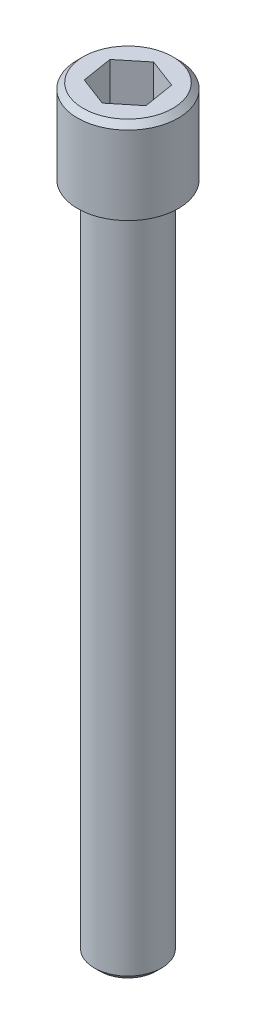
ISO-10303-21;
HEADER;
FILE_DESCRIPTION(('STEP AP214'),'2;1');
FILE_NAME('part.step','',(''),(''),'','','');
FILE_SCHEMA(('AUTOMOTIVE_DESIGN { 1 0 10303 214 1 1 1 1 }'));
ENDSEC;
DATA;
#1=APPLICATION_CONTEXT('core data for automotive mechanical design processes');
#2=APPLICATION_PROTOCOL_DEFINITION('international standard','automotive_design',2000,#1);
#3=PRODUCT_CONTEXT('',#1,'mechanical');
#4=PRODUCT('Part','Part','',(#3));
#5=PRODUCT_RELATED_PRODUCT_CATEGORY('part','',(#4));
#6=PRODUCT_DEFINITION_FORMATION('','',#4);
#7=PRODUCT_DEFINITION_CONTEXT('part definition',#1,'design');
#8=PRODUCT_DEFINITION('design','',#6,#7);
#9=PRODUCT_DEFINITION_SHAPE('','',#8);
#10=(LENGTH_UNIT() NAMED_UNIT(*) SI_UNIT(.MILLI.,.METRE.));
#11=(NAMED_UNIT(*) PLANE_ANGLE_UNIT() SI_UNIT($,.RADIAN.));
#12=(NAMED_UNIT(*) SI_UNIT($,.STERADIAN.) SOLID_ANGLE_UNIT());
#13=UNCERTAINTY_MEASURE_WITH_UNIT(LENGTH_MEASURE(1.E-05),#10,'distance_accuracy_value','');
#14=(GEOMETRIC_REPRESENTATION_CONTEXT(3) GLOBAL_UNCERTAINTY_ASSIGNED_CONTEXT((#13)) GLOBAL_UNIT_ASSIGNED_CONTEXT((#10,
#11,#12)) REPRESENTATION_CONTEXT('',''));
#15=CARTESIAN_POINT('',(0.,0.,0.));
#16=DIRECTION('',(0.,0.,1.));
#17=DIRECTION('',(1.,0.,0.));
#18=AXIS2_PLACEMENT_3D('',#15,#16,#17);
#19=CARTESIAN_POINT('',(0.,30.,0.));
#20=DIRECTION('',(0.,-1.,0.));
#21=DIRECTION('',(0.,0.,-1.));
#22=AXIS2_PLACEMENT_3D('',#19,#20,#21);
#23=CYLINDRICAL_SURFACE('',#22,1.5);
#24=CARTESIAN_POINT('',(0.,0.25,0.));
#25=DIRECTION('',(0.,1.,0.));
#26=DIRECTION('',(0.,0.,1.));
#27=AXIS2_PLACEMENT_3D('',#24,#25,#26);
#28=CIRCLE('',#27,1.5);
#29=CARTESIAN_POINT('',(0.,0.25,1.5));
#30=VERTEX_POINT('',#29);
#31=EDGE_CURVE('E43',#30,#30,#28,.T.);
#32=ORIENTED_EDGE('',*,*,#31,.T.);
#33=EDGE_LOOP('',(#32));
#34=FACE_BOUND('',#33,.T.);
#35=CARTESIAN_POINT('',(0.,30.,0.));
#36=DIRECTION('',(0.,1.,0.));
#37=DIRECTION('',(0.,0.,1.));
#38=AXIS2_PLACEMENT_3D('',#35,#36,#37);
#39=CIRCLE('',#38,1.5);
#40=CARTESIAN_POINT('',(0.,30.,1.5));
#41=VERTEX_POINT('',#40);
#42=EDGE_CURVE('E145',#41,#41,#39,.T.);
#43=ORIENTED_EDGE('',*,*,#42,.F.);
#44=EDGE_LOOP('',(#43));
#45=FACE_BOUND('',#44,.T.);
#46=ADVANCED_FACE('F35',(#34,#45),#23,.T.);
#47=CARTESIAN_POINT('',(0.,0.,0.));
#48=DIRECTION('',(0.,1.,0.));
#49=DIRECTION('',(0.,0.,1.));
#50=AXIS2_PLACEMENT_3D('',#47,#48,#49);
#51=PLANE('',#50);
#52=CARTESIAN_POINT('',(0.,0.,0.));
#53=DIRECTION('',(0.,1.,0.));
#54=DIRECTION('',(0.,0.,1.));
#55=AXIS2_PLACEMENT_3D('',#52,#53,#54);
#56=CIRCLE('',#55,1.25);
#57=CARTESIAN_POINT('',(0.,0.,1.25));
#58=VERTEX_POINT('',#57);
#59=EDGE_CURVE('E11',#58,#58,#56,.F.);
#60=ORIENTED_EDGE('',*,*,#59,.T.);
#61=EDGE_LOOP('',(#60));
#62=FACE_BOUND('',#61,.T.);
#63=ADVANCED_FACE('F167',(#62),#51,.F.);
#64=CARTESIAN_POINT('',(0.,33.75,0.));
#65=DIRECTION('',(0.,-1.,0.));
#66=DIRECTION('',(0.,0.,-1.));
#67=AXIS2_PLACEMENT_3D('',#64,#65,#66);
#68=CYLINDRICAL_SURFACE('',#67,2.25);
#69=CARTESIAN_POINT('',(0.,33.5,0.));
#70=DIRECTION('',(0.,1.,0.));
#71=DIRECTION('',(0.,0.,1.));
#72=AXIS2_PLACEMENT_3D('',#69,#70,#71);
#73=CIRCLE('',#72,2.25);
#74=CARTESIAN_POINT('',(0.,33.5,2.25));
#75=VERTEX_POINT('',#74);
#76=EDGE_CURVE('E151',#75,#75,#73,.F.);
#77=ORIENTED_EDGE('',*,*,#76,.T.);
#78=EDGE_LOOP('',(#77));
#79=FACE_BOUND('',#78,.T.);
#80=CARTESIAN_POINT('',(0.,30.,0.));
#81=DIRECTION('',(0.,1.,0.));
#82=DIRECTION('',(0.,0.,1.));
#83=AXIS2_PLACEMENT_3D('',#80,#81,#82);
#84=CIRCLE('',#83,2.25);
#85=CARTESIAN_POINT('',(0.,30.,2.25));
#86=VERTEX_POINT('',#85);
#87=EDGE_CURVE('E137',#86,#86,#84,.T.);
#88=ORIENTED_EDGE('',*,*,#87,.T.);
#89=EDGE_LOOP('',(#88));
#90=FACE_BOUND('',#89,.T.);
#91=ADVANCED_FACE('F172',(#79,#90),#68,.T.);
#92=CARTESIAN_POINT('',(0.,33.75,0.));
#93=DIRECTION('',(0.,1.,0.));
#94=DIRECTION('',(0.,0.,1.));
#95=AXIS2_PLACEMENT_3D('',#92,#93,#94);
#96=PLANE('',#95);
#97=CARTESIAN_POINT('',(0.,33.75,0.));
#98=DIRECTION('',(0.,1.,0.));
#99=DIRECTION('',(0.,0.,1.));
#100=AXIS2_PLACEMENT_3D('',#97,#98,#99);
#101=CIRCLE('',#100,2.);
#102=CARTESIAN_POINT('',(0.,33.75,2.));
#103=VERTEX_POINT('',#102);
#104=EDGE_CURVE('E148',#103,#103,#101,.T.);
#105=ORIENTED_EDGE('',*,*,#104,.T.);
#106=EDGE_LOOP('',(#105));
#107=FACE_BOUND('',#106,.T.);
#108=DIRECTION('',(0.159195520088402,0.,0.987247074639263));
#109=VECTOR('',#108,1.);
#110=CARTESIAN_POINT('',(-1.2949903812193,33.75,-0.492950213053497));
#111=LINE('',#110,#109);
#112=CARTESIAN_POINT('',(-1.2949903812193,33.75,-0.492950213053497));
#113=VERTEX_POINT('',#112);
#114=CARTESIAN_POINT('',(-1.07440259791493,33.75,0.875019461265662));
#115=VERTEX_POINT('',#114);
#116=EDGE_CURVE('E50',#113,#115,#111,.T.);
#117=ORIENTED_EDGE('',*,*,#116,.F.);
#118=DIRECTION('',(-0.775383286405273,0.,0.631490901884864));
#119=VECTOR('',#118,1.);
#120=CARTESIAN_POINT('',(-0.220587783304371,33.75,-1.36796967431916));
#121=LINE('',#120,#119);
#122=CARTESIAN_POINT('',(-0.220587783304371,33.75,-1.36796967431916));
#123=VERTEX_POINT('',#122);
#124=EDGE_CURVE('E133',#123,#113,#121,.T.);
#125=ORIENTED_EDGE('',*,*,#124,.F.);
#126=DIRECTION('',(-0.934578806493675,0.,-0.3557561727544));
#127=VECTOR('',#126,1.);
#128=CARTESIAN_POINT('',(1.07440259791493,33.75,-0.875019461265662));
#129=LINE('',#128,#127);
#130=CARTESIAN_POINT('',(1.07440259791493,33.75,-0.875019461265662));
#131=VERTEX_POINT('',#130);
#132=EDGE_CURVE('E131',#131,#123,#129,.T.);
#133=ORIENTED_EDGE('',*,*,#132,.F.);
#134=DIRECTION('',(-0.159195520088402,0.,-0.987247074639263));
#135=VECTOR('',#134,1.);
#136=CARTESIAN_POINT('',(1.2949903812193,33.75,0.492950213053496));
#137=LINE('',#136,#135);
#138=CARTESIAN_POINT('',(1.2949903812193,33.75,0.492950213053496));
#139=VERTEX_POINT('',#138);
#140=EDGE_CURVE('E98',#139,#131,#137,.T.);
#141=ORIENTED_EDGE('',*,*,#140,.F.);
#142=DIRECTION('',(0.775383286405273,0.,-0.631490901884864));
#143=VECTOR('',#142,1.);
#144=CARTESIAN_POINT('',(0.220587783304371,33.75,1.36796967431916));
#145=LINE('',#144,#143);
#146=CARTESIAN_POINT('',(0.220587783304371,33.75,1.36796967431916));
#147=VERTEX_POINT('',#146);
#148=EDGE_CURVE('E127',#147,#139,#145,.T.);
#149=ORIENTED_EDGE('',*,*,#148,.F.);
#150=DIRECTION('',(0.934578806493675,0.,0.3557561727544));
#151=VECTOR('',#150,1.);
#152=CARTESIAN_POINT('',(-1.07440259791493,33.75,0.875019461265662));
#153=LINE('',#152,#151);
#154=EDGE_CURVE('E124',#115,#147,#153,.T.);
#155=ORIENTED_EDGE('',*,*,#154,.F.);
#156=EDGE_LOOP('',(#117,#125,#133,#141,#149,#155));
#157=FACE_BOUND('',#156,.T.);
#158=ADVANCED_FACE('F178',(#107,#157),#96,.T.);
#159=CARTESIAN_POINT('',(0.,30.,0.));
#160=DIRECTION('',(0.,1.,0.));
#161=DIRECTION('',(0.,0.,1.));
#162=AXIS2_PLACEMENT_3D('',#159,#160,#161);
#163=PLANE('',#162);
#164=ORIENTED_EDGE('',*,*,#42,.T.);
#165=EDGE_LOOP('',(#164));
#166=FACE_BOUND('',#165,.T.);
#167=ORIENTED_EDGE('',*,*,#87,.F.);
#168=EDGE_LOOP('',(#167));
#169=FACE_BOUND('',#168,.T.);
#170=ADVANCED_FACE('F180',(#166,#169),#163,.F.);
#171=CARTESIAN_POINT('',(-1.2949903812193,31.5,-0.492950213053497));
#172=DIRECTION('',(-0.987247074639263,0.,0.159195520088402));
#173=DIRECTION('',(0.159195520088402,0.,0.987247074639263));
#174=AXIS2_PLACEMENT_3D('',#171,#172,#173);
#175=PLANE('',#174);
#176=ORIENTED_EDGE('',*,*,#116,.T.);
#177=DIRECTION('',(0.,1.,0.));
#178=VECTOR('',#177,1.);
#179=CARTESIAN_POINT('',(-1.07440259791493,31.5,0.875019461265662));
#180=LINE('',#179,#178);
#181=CARTESIAN_POINT('',(-1.07440259791493,31.5,0.875019461265662));
#182=VERTEX_POINT('',#181);
#183=EDGE_CURVE('E80',#182,#115,#180,.T.);
#184=ORIENTED_EDGE('',*,*,#183,.F.);
#185=DIRECTION('',(0.159195520088402,0.,0.987247074639263));
#186=VECTOR('',#185,1.);
#187=CARTESIAN_POINT('',(-1.2949903812193,31.5,-0.492950213053497));
#188=LINE('',#187,#186);
#189=CARTESIAN_POINT('',(-1.2949903812193,31.5,-0.492950213053497));
#190=VERTEX_POINT('',#189);
#191=EDGE_CURVE('E135',#190,#182,#188,.T.);
#192=ORIENTED_EDGE('',*,*,#191,.F.);
#193=DIRECTION('',(0.,1.,0.));
#194=VECTOR('',#193,1.);
#195=CARTESIAN_POINT('',(-1.2949903812193,31.5,-0.492950213053497));
#196=LINE('',#195,#194);
#197=EDGE_CURVE('E58',#190,#113,#196,.T.);
#198=ORIENTED_EDGE('',*,*,#197,.T.);
#199=EDGE_LOOP('',(#176,#184,#192,#198));
#200=FACE_BOUND('',#199,.T.);
#201=ADVANCED_FACE('F183',(#200),#175,.F.);
#202=CARTESIAN_POINT('',(-0.220587783304371,31.5,-1.36796967431916));
#203=DIRECTION('',(-0.631490901884864,0.,-0.775383286405273));
#204=DIRECTION('',(-0.775383286405273,0.,0.631490901884864));
#205=AXIS2_PLACEMENT_3D('',#202,#203,#204);
#206=PLANE('',#205);
#207=ORIENTED_EDGE('',*,*,#124,.T.);
#208=ORIENTED_EDGE('',*,*,#197,.F.);
#209=DIRECTION('',(-0.775383286405273,0.,0.631490901884864));
#210=VECTOR('',#209,1.);
#211=CARTESIAN_POINT('',(-0.220587783304371,31.5,-1.36796967431916));
#212=LINE('',#211,#210);
#213=CARTESIAN_POINT('',(-0.220587783304371,31.5,-1.36796967431916));
#214=VERTEX_POINT('',#213);
#215=EDGE_CURVE('E110',#214,#190,#212,.T.);
#216=ORIENTED_EDGE('',*,*,#215,.F.);
#217=DIRECTION('',(0.,1.,0.));
#218=VECTOR('',#217,1.);
#219=CARTESIAN_POINT('',(-0.220587783304371,31.5,-1.36796967431916));
#220=LINE('',#219,#218);
#221=EDGE_CURVE('E102',#214,#123,#220,.T.);
#222=ORIENTED_EDGE('',*,*,#221,.T.);
#223=EDGE_LOOP('',(#207,#208,#216,#222));
#224=FACE_BOUND('',#223,.T.);
#225=ADVANCED_FACE('F190',(#224),#206,.F.);
#226=CARTESIAN_POINT('',(1.07440259791493,31.5,-0.875019461265662));
#227=DIRECTION('',(0.3557561727544,0.,-0.934578806493675));
#228=DIRECTION('',(-0.934578806493675,0.,-0.3557561727544));
#229=AXIS2_PLACEMENT_3D('',#226,#227,#228);
#230=PLANE('',#229);
#231=ORIENTED_EDGE('',*,*,#132,.T.);
#232=ORIENTED_EDGE('',*,*,#221,.F.);
#233=DIRECTION('',(-0.934578806493675,0.,-0.3557561727544));
#234=VECTOR('',#233,1.);
#235=CARTESIAN_POINT('',(1.07440259791493,31.5,-0.875019461265662));
#236=LINE('',#235,#234);
#237=CARTESIAN_POINT('',(1.07440259791493,31.5,-0.875019461265662));
#238=VERTEX_POINT('',#237);
#239=EDGE_CURVE('E106',#238,#214,#236,.T.);
#240=ORIENTED_EDGE('',*,*,#239,.F.);
#241=DIRECTION('',(0.,1.,0.));
#242=VECTOR('',#241,1.);
#243=CARTESIAN_POINT('',(1.07440259791493,31.5,-0.875019461265662));
#244=LINE('',#243,#242);
#245=EDGE_CURVE('E91',#238,#131,#244,.T.);
#246=ORIENTED_EDGE('',*,*,#245,.T.);
#247=EDGE_LOOP('',(#231,#232,#240,#246));
#248=FACE_BOUND('',#247,.T.);
#249=ADVANCED_FACE('F107',(#248),#230,.F.);
#250=CARTESIAN_POINT('',(1.2949903812193,31.5,0.492950213053496));
#251=DIRECTION('',(0.987247074639263,0.,-0.159195520088402));
#252=DIRECTION('',(-0.159195520088403,0.,-0.987247074639263));
#253=AXIS2_PLACEMENT_3D('',#250,#251,#252);
#254=PLANE('',#253);
#255=ORIENTED_EDGE('',*,*,#140,.T.);
#256=ORIENTED_EDGE('',*,*,#245,.F.);
#257=DIRECTION('',(-0.159195520088402,0.,-0.987247074639263));
#258=VECTOR('',#257,1.);
#259=CARTESIAN_POINT('',(1.2949903812193,31.5,0.492950213053496));
#260=LINE('',#259,#258);
#261=CARTESIAN_POINT('',(1.2949903812193,31.5,0.492950213053496));
#262=VERTEX_POINT('',#261);
#263=EDGE_CURVE('E95',#262,#238,#260,.T.);
#264=ORIENTED_EDGE('',*,*,#263,.F.);
#265=DIRECTION('',(0.,1.,0.));
#266=VECTOR('',#265,1.);
#267=CARTESIAN_POINT('',(1.2949903812193,31.5,0.492950213053496));
#268=LINE('',#267,#266);
#269=EDGE_CURVE('E103',#262,#139,#268,.T.);
#270=ORIENTED_EDGE('',*,*,#269,.T.);
#271=EDGE_LOOP('',(#255,#256,#264,#270));
#272=FACE_BOUND('',#271,.T.);
#273=ADVANCED_FACE('F93',(#272),#254,.F.);
#274=CARTESIAN_POINT('',(0.220587783304371,31.5,1.36796967431916));
#275=DIRECTION('',(0.631490901884864,0.,0.775383286405273));
#276=DIRECTION('',(0.775383286405273,0.,-0.631490901884864));
#277=AXIS2_PLACEMENT_3D('',#274,#275,#276);
#278=PLANE('',#277);
#279=ORIENTED_EDGE('',*,*,#148,.T.);
#280=ORIENTED_EDGE('',*,*,#269,.F.);
#281=DIRECTION('',(0.775383286405273,0.,-0.631490901884864));
#282=VECTOR('',#281,1.);
#283=CARTESIAN_POINT('',(0.220587783304371,31.5,1.36796967431916));
#284=LINE('',#283,#282);
#285=CARTESIAN_POINT('',(0.220587783304371,31.5,1.36796967431916));
#286=VERTEX_POINT('',#285);
#287=EDGE_CURVE('E116',#286,#262,#284,.T.);
#288=ORIENTED_EDGE('',*,*,#287,.F.);
#289=DIRECTION('',(0.,1.,0.));
#290=VECTOR('',#289,1.);
#291=CARTESIAN_POINT('',(0.220587783304371,31.5,1.36796967431916));
#292=LINE('',#291,#290);
#293=EDGE_CURVE('E140',#286,#147,#292,.T.);
#294=ORIENTED_EDGE('',*,*,#293,.T.);
#295=EDGE_LOOP('',(#279,#280,#288,#294));
#296=FACE_BOUND('',#295,.T.);
#297=ADVANCED_FACE('F194',(#296),#278,.F.);
#298=CARTESIAN_POINT('',(-1.07440259791493,31.5,0.875019461265662));
#299=DIRECTION('',(-0.3557561727544,0.,0.934578806493675));
#300=DIRECTION('',(0.934578806493675,0.,0.3557561727544));
#301=AXIS2_PLACEMENT_3D('',#298,#299,#300);
#302=PLANE('',#301);
#303=ORIENTED_EDGE('',*,*,#154,.T.);
#304=ORIENTED_EDGE('',*,*,#293,.F.);
#305=DIRECTION('',(0.934578806493675,0.,0.3557561727544));
#306=VECTOR('',#305,1.);
#307=CARTESIAN_POINT('',(-1.07440259791493,31.5,0.875019461265662));
#308=LINE('',#307,#306);
#309=EDGE_CURVE('E118',#182,#286,#308,.T.);
#310=ORIENTED_EDGE('',*,*,#309,.F.);
#311=ORIENTED_EDGE('',*,*,#183,.T.);
#312=EDGE_LOOP('',(#303,#304,#310,#311));
#313=FACE_BOUND('',#312,.T.);
#314=ADVANCED_FACE('F191',(#313),#302,.F.);
#315=CARTESIAN_POINT('',(0.,31.5,0.));
#316=DIRECTION('',(0.,1.,0.));
#317=DIRECTION('',(0.,0.,1.));
#318=AXIS2_PLACEMENT_3D('',#315,#316,#317);
#319=PLANE('',#318);
#320=ORIENTED_EDGE('',*,*,#191,.T.);
#321=ORIENTED_EDGE('',*,*,#309,.T.);
#322=ORIENTED_EDGE('',*,*,#287,.T.);
#323=ORIENTED_EDGE('',*,*,#263,.T.);
#324=ORIENTED_EDGE('',*,*,#239,.T.);
#325=ORIENTED_EDGE('',*,*,#215,.T.);
#326=EDGE_LOOP('',(#320,#321,#322,#323,#324,#325));
#327=FACE_BOUND('',#326,.T.);
#328=ADVANCED_FACE('F113',(#327),#319,.T.);
#329=CARTESIAN_POINT('',(0.,33.75,0.));
#330=DIRECTION('',(0.,-1.,0.));
#331=DIRECTION('',(0.,0.,-1.));
#332=AXIS2_PLACEMENT_3D('',#329,#330,#331);
#333=CONICAL_SURFACE('',#332,2.,0.785398163397437);
#334=ORIENTED_EDGE('',*,*,#76,.F.);
#335=EDGE_LOOP('',(#334));
#336=FACE_BOUND('',#335,.T.);
#337=ORIENTED_EDGE('',*,*,#104,.F.);
#338=EDGE_LOOP('',(#337));
#339=FACE_BOUND('',#338,.T.);
#340=ADVANCED_FACE('F159',(#336,#339),#333,.T.);
#341=CARTESIAN_POINT('',(0.,0.25,0.));
#342=DIRECTION('',(0.,1.,0.));
#343=DIRECTION('',(0.,0.,1.));
#344=AXIS2_PLACEMENT_3D('',#341,#342,#343);
#345=CONICAL_SURFACE('',#344,1.5,0.785398163397452);
#346=ORIENTED_EDGE('',*,*,#59,.F.);
#347=EDGE_LOOP('',(#346));
#348=FACE_BOUND('',#347,.T.);
#349=ORIENTED_EDGE('',*,*,#31,.F.);
#350=EDGE_LOOP('',(#349));
#351=FACE_BOUND('',#350,.T.);
#352=ADVANCED_FACE('F37',(#348,#351),#345,.T.);
#353=CLOSED_SHELL('',(#46,#63,#91,#158,#170,#201,#225,#249,#273,#297,#314,#328,#340,#352));
#354=MANIFOLD_SOLID_BREP('B2',#353);
#355=ADVANCED_BREP_SHAPE_REPRESENTATION('',(#18,#354),#14);
#356=SHAPE_DEFINITION_REPRESENTATION(#9,#355);
ENDSEC;
END-ISO-10303-21;
